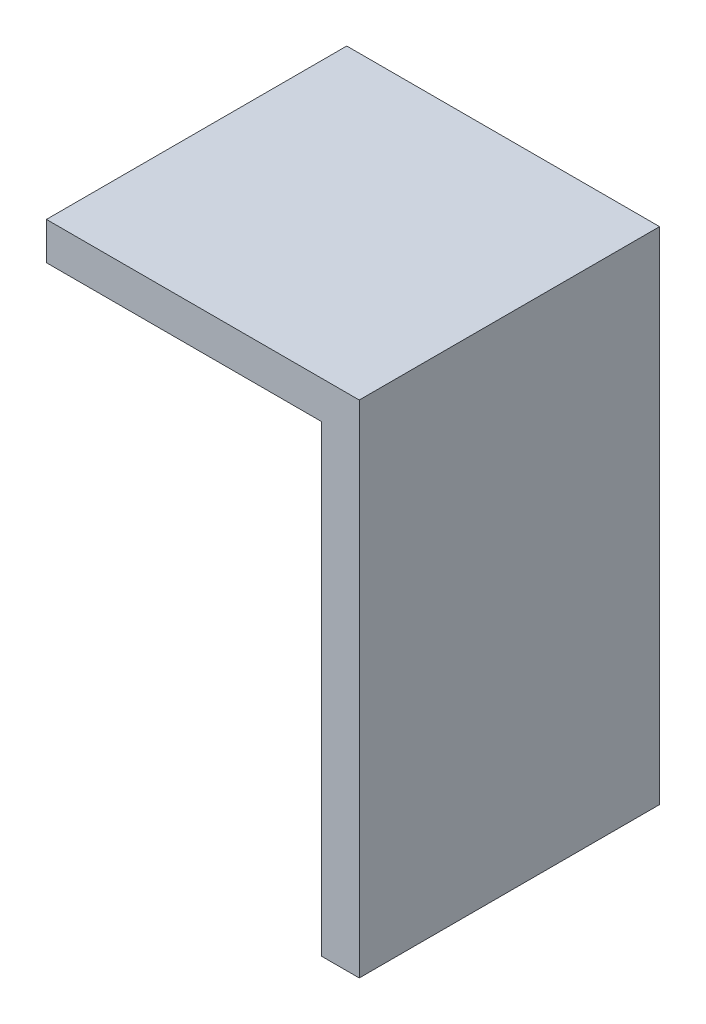
ISO-10303-21;
HEADER;
FILE_DESCRIPTION(('STEP AP214'),'2;1');
FILE_NAME('part.step','',(''),(''),'','','');
FILE_SCHEMA(('AUTOMOTIVE_DESIGN { 1 0 10303 214 1 1 1 1 }'));
ENDSEC;
DATA;
#1=APPLICATION_CONTEXT('core data for automotive mechanical design processes');
#2=APPLICATION_PROTOCOL_DEFINITION('international standard','automotive_design',2000,#1);
#3=PRODUCT_CONTEXT('',#1,'mechanical');
#4=PRODUCT('Part','Part','',(#3));
#5=PRODUCT_RELATED_PRODUCT_CATEGORY('part','',(#4));
#6=PRODUCT_DEFINITION_FORMATION('','',#4);
#7=PRODUCT_DEFINITION_CONTEXT('part definition',#1,'design');
#8=PRODUCT_DEFINITION('design','',#6,#7);
#9=PRODUCT_DEFINITION_SHAPE('','',#8);
#10=(LENGTH_UNIT() NAMED_UNIT(*) SI_UNIT(.MILLI.,.METRE.));
#11=(NAMED_UNIT(*) PLANE_ANGLE_UNIT() SI_UNIT($,.RADIAN.));
#12=(NAMED_UNIT(*) SI_UNIT($,.STERADIAN.) SOLID_ANGLE_UNIT());
#13=UNCERTAINTY_MEASURE_WITH_UNIT(LENGTH_MEASURE(1.E-05),#10,'distance_accuracy_value','');
#14=(GEOMETRIC_REPRESENTATION_CONTEXT(3) GLOBAL_UNCERTAINTY_ASSIGNED_CONTEXT((#13)) GLOBAL_UNIT_ASSIGNED_CONTEXT((#10,
#11,#12)) REPRESENTATION_CONTEXT('',''));
#15=CARTESIAN_POINT('',(0.,0.,0.));
#16=DIRECTION('',(0.,0.,1.));
#17=DIRECTION('',(1.,0.,0.));
#18=AXIS2_PLACEMENT_3D('',#15,#16,#17);
#19=CARTESIAN_POINT('',(-12.5,40.,-12.));
#20=DIRECTION('',(1.,0.,0.));
#21=DIRECTION('',(0.,0.,-1.));
#22=AXIS2_PLACEMENT_3D('',#19,#20,#21);
#23=PLANE('',#22);
#24=DIRECTION('',(0.,0.,1.));
#25=VECTOR('',#24,1.);
#26=CARTESIAN_POINT('',(-12.5,37.,-12.));
#27=LINE('',#26,#25);
#28=CARTESIAN_POINT('',(-12.5,37.,-12.));
#29=VERTEX_POINT('',#28);
#30=CARTESIAN_POINT('',(-12.5,37.,12.));
#31=VERTEX_POINT('',#30);
#32=EDGE_CURVE('E120',#29,#31,#27,.T.);
#33=ORIENTED_EDGE('',*,*,#32,.T.);
#34=DIRECTION('',(0.,-1.,0.));
#35=VECTOR('',#34,1.);
#36=CARTESIAN_POINT('',(-12.5,40.,12.));
#37=LINE('',#36,#35);
#38=CARTESIAN_POINT('',(-12.5,40.,12.));
#39=VERTEX_POINT('',#38);
#40=EDGE_CURVE('E11',#39,#31,#37,.T.);
#41=ORIENTED_EDGE('',*,*,#40,.F.);
#42=DIRECTION('',(0.,0.,1.));
#43=VECTOR('',#42,1.);
#44=CARTESIAN_POINT('',(-12.5,40.,-12.));
#45=LINE('',#44,#43);
#46=CARTESIAN_POINT('',(-12.5,40.,-12.));
#47=VERTEX_POINT('',#46);
#48=EDGE_CURVE('E119',#47,#39,#45,.T.);
#49=ORIENTED_EDGE('',*,*,#48,.F.);
#50=DIRECTION('',(0.,-1.,0.));
#51=VECTOR('',#50,1.);
#52=CARTESIAN_POINT('',(-12.5,40.,-12.));
#53=LINE('',#52,#51);
#54=EDGE_CURVE('E124',#47,#29,#53,.T.);
#55=ORIENTED_EDGE('',*,*,#54,.T.);
#56=EDGE_LOOP('',(#33,#41,#49,#55));
#57=FACE_BOUND('',#56,.T.);
#58=ADVANCED_FACE('F43',(#57),#23,.F.);
#59=CARTESIAN_POINT('',(-12.5,40.,12.));
#60=DIRECTION('',(0.,0.,-1.));
#61=DIRECTION('',(-1.,0.,0.));
#62=AXIS2_PLACEMENT_3D('',#59,#60,#61);
#63=PLANE('',#62);
#64=DIRECTION('',(1.,0.,0.));
#65=VECTOR('',#64,1.);
#66=CARTESIAN_POINT('',(-12.5,37.,12.));
#67=LINE('',#66,#65);
#68=CARTESIAN_POINT('',(9.5,37.,12.));
#69=VERTEX_POINT('',#68);
#70=EDGE_CURVE('E116',#31,#69,#67,.T.);
#71=ORIENTED_EDGE('',*,*,#70,.T.);
#72=DIRECTION('',(0.,-1.,0.));
#73=VECTOR('',#72,1.);
#74=CARTESIAN_POINT('',(9.5,37.,12.));
#75=LINE('',#74,#73);
#76=CARTESIAN_POINT('',(9.5,0.,12.));
#77=VERTEX_POINT('',#76);
#78=EDGE_CURVE('E60',#69,#77,#75,.T.);
#79=ORIENTED_EDGE('',*,*,#78,.T.);
#80=DIRECTION('',(1.,0.,0.));
#81=VECTOR('',#80,1.);
#82=CARTESIAN_POINT('',(9.5,0.,12.));
#83=LINE('',#82,#81);
#84=CARTESIAN_POINT('',(12.5,0.,12.));
#85=VERTEX_POINT('',#84);
#86=EDGE_CURVE('E140',#77,#85,#83,.T.);
#87=ORIENTED_EDGE('',*,*,#86,.T.);
#88=DIRECTION('',(0.,-1.,0.));
#89=VECTOR('',#88,1.);
#90=CARTESIAN_POINT('',(12.5,40.,12.));
#91=LINE('',#90,#89);
#92=CARTESIAN_POINT('',(12.5,40.,12.));
#93=VERTEX_POINT('',#92);
#94=EDGE_CURVE('E49',#93,#85,#91,.T.);
#95=ORIENTED_EDGE('',*,*,#94,.F.);
#96=DIRECTION('',(1.,0.,0.));
#97=VECTOR('',#96,1.);
#98=CARTESIAN_POINT('',(-12.5,40.,12.));
#99=LINE('',#98,#97);
#100=EDGE_CURVE('E86',#39,#93,#99,.T.);
#101=ORIENTED_EDGE('',*,*,#100,.F.);
#102=ORIENTED_EDGE('',*,*,#40,.T.);
#103=EDGE_LOOP('',(#71,#79,#87,#95,#101,#102));
#104=FACE_BOUND('',#103,.T.);
#105=ADVANCED_FACE('F137',(#104),#63,.F.);
#106=CARTESIAN_POINT('',(12.5,40.,12.));
#107=DIRECTION('',(-1.,0.,0.));
#108=DIRECTION('',(0.,0.,1.));
#109=AXIS2_PLACEMENT_3D('',#106,#107,#108);
#110=PLANE('',#109);
#111=ORIENTED_EDGE('',*,*,#94,.T.);
#112=DIRECTION('',(0.,0.,-1.));
#113=VECTOR('',#112,1.);
#114=CARTESIAN_POINT('',(12.5,0.,12.));
#115=LINE('',#114,#113);
#116=CARTESIAN_POINT('',(12.5,0.,-12.));
#117=VERTEX_POINT('',#116);
#118=EDGE_CURVE('E133',#85,#117,#115,.T.);
#119=ORIENTED_EDGE('',*,*,#118,.T.);
#120=DIRECTION('',(0.,-1.,0.));
#121=VECTOR('',#120,1.);
#122=CARTESIAN_POINT('',(12.5,40.,-12.));
#123=LINE('',#122,#121);
#124=CARTESIAN_POINT('',(12.5,40.,-12.));
#125=VERTEX_POINT('',#124);
#126=EDGE_CURVE('E130',#125,#117,#123,.T.);
#127=ORIENTED_EDGE('',*,*,#126,.F.);
#128=DIRECTION('',(0.,0.,-1.));
#129=VECTOR('',#128,1.);
#130=CARTESIAN_POINT('',(12.5,40.,12.));
#131=LINE('',#130,#129);
#132=EDGE_CURVE('E136',#93,#125,#131,.T.);
#133=ORIENTED_EDGE('',*,*,#132,.F.);
#134=EDGE_LOOP('',(#111,#119,#127,#133));
#135=FACE_BOUND('',#134,.T.);
#136=ADVANCED_FACE('F135',(#135),#110,.F.);
#137=CARTESIAN_POINT('',(12.5,40.,-12.));
#138=DIRECTION('',(0.,0.,1.));
#139=DIRECTION('',(1.,0.,0.));
#140=AXIS2_PLACEMENT_3D('',#137,#138,#139);
#141=PLANE('',#140);
#142=ORIENTED_EDGE('',*,*,#126,.T.);
#143=DIRECTION('',(-1.,0.,0.));
#144=VECTOR('',#143,1.);
#145=CARTESIAN_POINT('',(12.5,0.,-12.));
#146=LINE('',#145,#144);
#147=CARTESIAN_POINT('',(9.5,0.,-12.));
#148=VERTEX_POINT('',#147);
#149=EDGE_CURVE('E106',#117,#148,#146,.T.);
#150=ORIENTED_EDGE('',*,*,#149,.T.);
#151=DIRECTION('',(0.,-1.,0.));
#152=VECTOR('',#151,1.);
#153=CARTESIAN_POINT('',(9.5,37.,-12.));
#154=LINE('',#153,#152);
#155=CARTESIAN_POINT('',(9.5,37.,-12.));
#156=VERTEX_POINT('',#155);
#157=EDGE_CURVE('E103',#156,#148,#154,.T.);
#158=ORIENTED_EDGE('',*,*,#157,.F.);
#159=DIRECTION('',(-1.,0.,0.));
#160=VECTOR('',#159,1.);
#161=CARTESIAN_POINT('',(12.5,37.,-12.));
#162=LINE('',#161,#160);
#163=EDGE_CURVE('E81',#156,#29,#162,.T.);
#164=ORIENTED_EDGE('',*,*,#163,.T.);
#165=ORIENTED_EDGE('',*,*,#54,.F.);
#166=DIRECTION('',(-1.,0.,0.));
#167=VECTOR('',#166,1.);
#168=CARTESIAN_POINT('',(12.5,40.,-12.));
#169=LINE('',#168,#167);
#170=EDGE_CURVE('E66',#125,#47,#169,.T.);
#171=ORIENTED_EDGE('',*,*,#170,.F.);
#172=EDGE_LOOP('',(#142,#150,#158,#164,#165,#171));
#173=FACE_BOUND('',#172,.T.);
#174=ADVANCED_FACE('F102',(#173),#141,.F.);
#175=CARTESIAN_POINT('',(0.,40.,0.));
#176=DIRECTION('',(0.,1.,0.));
#177=DIRECTION('',(0.,0.,1.));
#178=AXIS2_PLACEMENT_3D('',#175,#176,#177);
#179=PLANE('',#178);
#180=ORIENTED_EDGE('',*,*,#48,.T.);
#181=ORIENTED_EDGE('',*,*,#100,.T.);
#182=ORIENTED_EDGE('',*,*,#132,.T.);
#183=ORIENTED_EDGE('',*,*,#170,.T.);
#184=EDGE_LOOP('',(#180,#181,#182,#183));
#185=FACE_BOUND('',#184,.T.);
#186=ADVANCED_FACE('F153',(#185),#179,.T.);
#187=CARTESIAN_POINT('',(0.,37.,0.));
#188=DIRECTION('',(0.,1.,0.));
#189=DIRECTION('',(0.,0.,1.));
#190=AXIS2_PLACEMENT_3D('',#187,#188,#189);
#191=PLANE('',#190);
#192=ORIENTED_EDGE('',*,*,#163,.F.);
#193=DIRECTION('',(0.,0.,1.));
#194=VECTOR('',#193,1.);
#195=CARTESIAN_POINT('',(9.5,37.,-12.));
#196=LINE('',#195,#194);
#197=EDGE_CURVE('E107',#156,#69,#196,.T.);
#198=ORIENTED_EDGE('',*,*,#197,.T.);
#199=ORIENTED_EDGE('',*,*,#70,.F.);
#200=ORIENTED_EDGE('',*,*,#32,.F.);
#201=EDGE_LOOP('',(#192,#198,#199,#200));
#202=FACE_BOUND('',#201,.T.);
#203=ADVANCED_FACE('F113',(#202),#191,.F.);
#204=CARTESIAN_POINT('',(9.5,37.,-12.));
#205=DIRECTION('',(1.,0.,0.));
#206=DIRECTION('',(0.,0.,-1.));
#207=AXIS2_PLACEMENT_3D('',#204,#205,#206);
#208=PLANE('',#207);
#209=DIRECTION('',(0.,0.,1.));
#210=VECTOR('',#209,1.);
#211=CARTESIAN_POINT('',(9.5,0.,-12.));
#212=LINE('',#211,#210);
#213=EDGE_CURVE('E139',#148,#77,#212,.T.);
#214=ORIENTED_EDGE('',*,*,#213,.T.);
#215=ORIENTED_EDGE('',*,*,#78,.F.);
#216=ORIENTED_EDGE('',*,*,#197,.F.);
#217=ORIENTED_EDGE('',*,*,#157,.T.);
#218=EDGE_LOOP('',(#214,#215,#216,#217));
#219=FACE_BOUND('',#218,.T.);
#220=ADVANCED_FACE('F109',(#219),#208,.F.);
#221=CARTESIAN_POINT('',(0.,0.,0.));
#222=DIRECTION('',(0.,1.,0.));
#223=DIRECTION('',(0.,0.,1.));
#224=AXIS2_PLACEMENT_3D('',#221,#222,#223);
#225=PLANE('',#224);
#226=ORIENTED_EDGE('',*,*,#213,.F.);
#227=ORIENTED_EDGE('',*,*,#149,.F.);
#228=ORIENTED_EDGE('',*,*,#118,.F.);
#229=ORIENTED_EDGE('',*,*,#86,.F.);
#230=EDGE_LOOP('',(#226,#227,#228,#229));
#231=FACE_BOUND('',#230,.T.);
#232=ADVANCED_FACE('F142',(#231),#225,.F.);
#233=CLOSED_SHELL('',(#58,#105,#136,#174,#186,#203,#220,#232));
#234=MANIFOLD_SOLID_BREP('B2',#233);
#235=ADVANCED_BREP_SHAPE_REPRESENTATION('',(#18,#234),#14);
#236=SHAPE_DEFINITION_REPRESENTATION(#9,#235);
ENDSEC;
END-ISO-10303-21;
